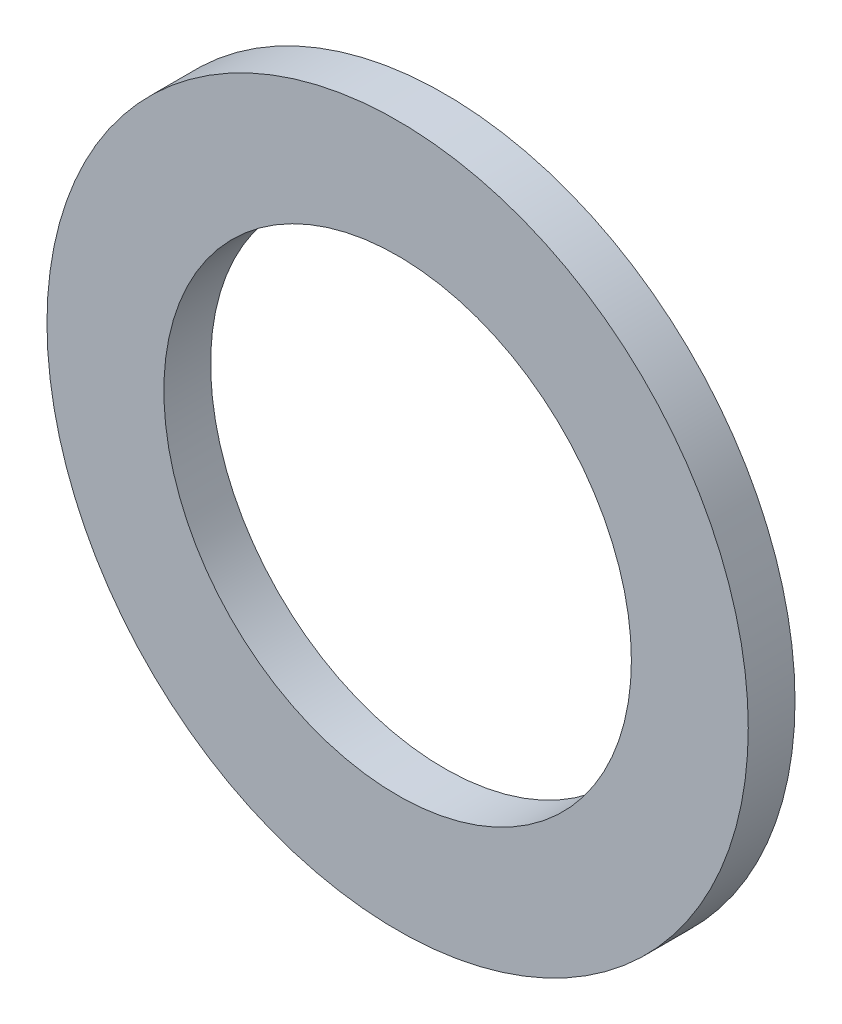
ISO-10303-21;
HEADER;
FILE_DESCRIPTION(('STEP AP214'),'2;1');
FILE_NAME('part.step','',(''),(''),'','','');
FILE_SCHEMA(('AUTOMOTIVE_DESIGN { 1 0 10303 214 1 1 1 1 }'));
ENDSEC;
DATA;
#1=APPLICATION_CONTEXT('core data for automotive mechanical design processes');
#2=APPLICATION_PROTOCOL_DEFINITION('international standard','automotive_design',2000,#1);
#3=PRODUCT_CONTEXT('',#1,'mechanical');
#4=PRODUCT('Part','Part','',(#3));
#5=PRODUCT_RELATED_PRODUCT_CATEGORY('part','',(#4));
#6=PRODUCT_DEFINITION_FORMATION('','',#4);
#7=PRODUCT_DEFINITION_CONTEXT('part definition',#1,'design');
#8=PRODUCT_DEFINITION('design','',#6,#7);
#9=PRODUCT_DEFINITION_SHAPE('','',#8);
#10=(LENGTH_UNIT() NAMED_UNIT(*) SI_UNIT(.MILLI.,.METRE.));
#11=(NAMED_UNIT(*) PLANE_ANGLE_UNIT() SI_UNIT($,.RADIAN.));
#12=(NAMED_UNIT(*) SI_UNIT($,.STERADIAN.) SOLID_ANGLE_UNIT());
#13=UNCERTAINTY_MEASURE_WITH_UNIT(LENGTH_MEASURE(1.E-05),#10,'distance_accuracy_value','');
#14=(GEOMETRIC_REPRESENTATION_CONTEXT(3) GLOBAL_UNCERTAINTY_ASSIGNED_CONTEXT((#13)) GLOBAL_UNIT_ASSIGNED_CONTEXT((#10,
#11,#12)) REPRESENTATION_CONTEXT('',''));
#15=CARTESIAN_POINT('',(0.,0.,0.));
#16=DIRECTION('',(0.,0.,1.));
#17=DIRECTION('',(1.,0.,0.));
#18=AXIS2_PLACEMENT_3D('',#15,#16,#17);
#19=CARTESIAN_POINT('',(0.,0.,2.));
#20=DIRECTION('',(0.,0.,1.));
#21=DIRECTION('',(1.,0.,0.));
#22=AXIS2_PLACEMENT_3D('',#19,#20,#21);
#23=PLANE('',#22);
#24=CARTESIAN_POINT('',(0.,0.,2.));
#25=DIRECTION('',(0.,0.,1.));
#26=DIRECTION('',(1.,0.,0.));
#27=AXIS2_PLACEMENT_3D('',#24,#25,#26);
#28=CIRCLE('',#27,15.);
#29=CARTESIAN_POINT('',(15.,0.,2.));
#30=VERTEX_POINT('',#29);
#31=EDGE_CURVE('E10',#30,#30,#28,.T.);
#32=ORIENTED_EDGE('',*,*,#31,.T.);
#33=EDGE_LOOP('',(#32));
#34=FACE_BOUND('',#33,.T.);
#35=CARTESIAN_POINT('',(0.,0.,2.));
#36=DIRECTION('',(0.,0.,1.));
#37=DIRECTION('',(1.,0.,0.));
#38=AXIS2_PLACEMENT_3D('',#35,#36,#37);
#39=CIRCLE('',#38,10.);
#40=CARTESIAN_POINT('',(10.,0.,2.));
#41=VERTEX_POINT('',#40);
#42=EDGE_CURVE('E42',#41,#41,#39,.T.);
#43=ORIENTED_EDGE('',*,*,#42,.F.);
#44=EDGE_LOOP('',(#43));
#45=FACE_BOUND('',#44,.T.);
#46=ADVANCED_FACE('F31',(#34,#45),#23,.T.);
#47=CARTESIAN_POINT('',(0.,0.,0.));
#48=DIRECTION('',(0.,0.,1.));
#49=DIRECTION('',(1.,0.,0.));
#50=AXIS2_PLACEMENT_3D('',#47,#48,#49);
#51=PLANE('',#50);
#52=CARTESIAN_POINT('',(0.,0.,0.));
#53=DIRECTION('',(0.,0.,1.));
#54=DIRECTION('',(1.,0.,0.));
#55=AXIS2_PLACEMENT_3D('',#52,#53,#54);
#56=CIRCLE('',#55,15.);
#57=CARTESIAN_POINT('',(15.,0.,0.));
#58=VERTEX_POINT('',#57);
#59=EDGE_CURVE('E38',#58,#58,#56,.T.);
#60=ORIENTED_EDGE('',*,*,#59,.F.);
#61=EDGE_LOOP('',(#60));
#62=FACE_BOUND('',#61,.T.);
#63=CARTESIAN_POINT('',(0.,0.,0.));
#64=DIRECTION('',(0.,0.,1.));
#65=DIRECTION('',(1.,0.,0.));
#66=AXIS2_PLACEMENT_3D('',#63,#64,#65);
#67=CIRCLE('',#66,10.);
#68=CARTESIAN_POINT('',(10.,0.,0.));
#69=VERTEX_POINT('',#68);
#70=EDGE_CURVE('E46',#69,#69,#67,.T.);
#71=ORIENTED_EDGE('',*,*,#70,.T.);
#72=EDGE_LOOP('',(#71));
#73=FACE_BOUND('',#72,.T.);
#74=ADVANCED_FACE('F52',(#62,#73),#51,.F.);
#75=CARTESIAN_POINT('',(0.,0.,2.));
#76=DIRECTION('',(0.,0.,-1.));
#77=DIRECTION('',(-1.,0.,0.));
#78=AXIS2_PLACEMENT_3D('',#75,#76,#77);
#79=CYLINDRICAL_SURFACE('',#78,15.);
#80=ORIENTED_EDGE('',*,*,#31,.F.);
#81=EDGE_LOOP('',(#80));
#82=FACE_BOUND('',#81,.T.);
#83=ORIENTED_EDGE('',*,*,#59,.T.);
#84=EDGE_LOOP('',(#83));
#85=FACE_BOUND('',#84,.T.);
#86=ADVANCED_FACE('F33',(#82,#85),#79,.T.);
#87=CARTESIAN_POINT('',(0.,0.,2.));
#88=DIRECTION('',(0.,0.,-1.));
#89=DIRECTION('',(-1.,0.,0.));
#90=AXIS2_PLACEMENT_3D('',#87,#88,#89);
#91=CYLINDRICAL_SURFACE('',#90,10.);
#92=ORIENTED_EDGE('',*,*,#42,.T.);
#93=EDGE_LOOP('',(#92));
#94=FACE_BOUND('',#93,.T.);
#95=ORIENTED_EDGE('',*,*,#70,.F.);
#96=EDGE_LOOP('',(#95));
#97=FACE_BOUND('',#96,.T.);
#98=ADVANCED_FACE('F54',(#94,#97),#91,.F.);
#99=CLOSED_SHELL('',(#46,#74,#86,#98));
#100=MANIFOLD_SOLID_BREP('B2',#99);
#101=ADVANCED_BREP_SHAPE_REPRESENTATION('',(#18,#100),#14);
#102=SHAPE_DEFINITION_REPRESENTATION(#9,#101);
ENDSEC;
END-ISO-10303-21;
